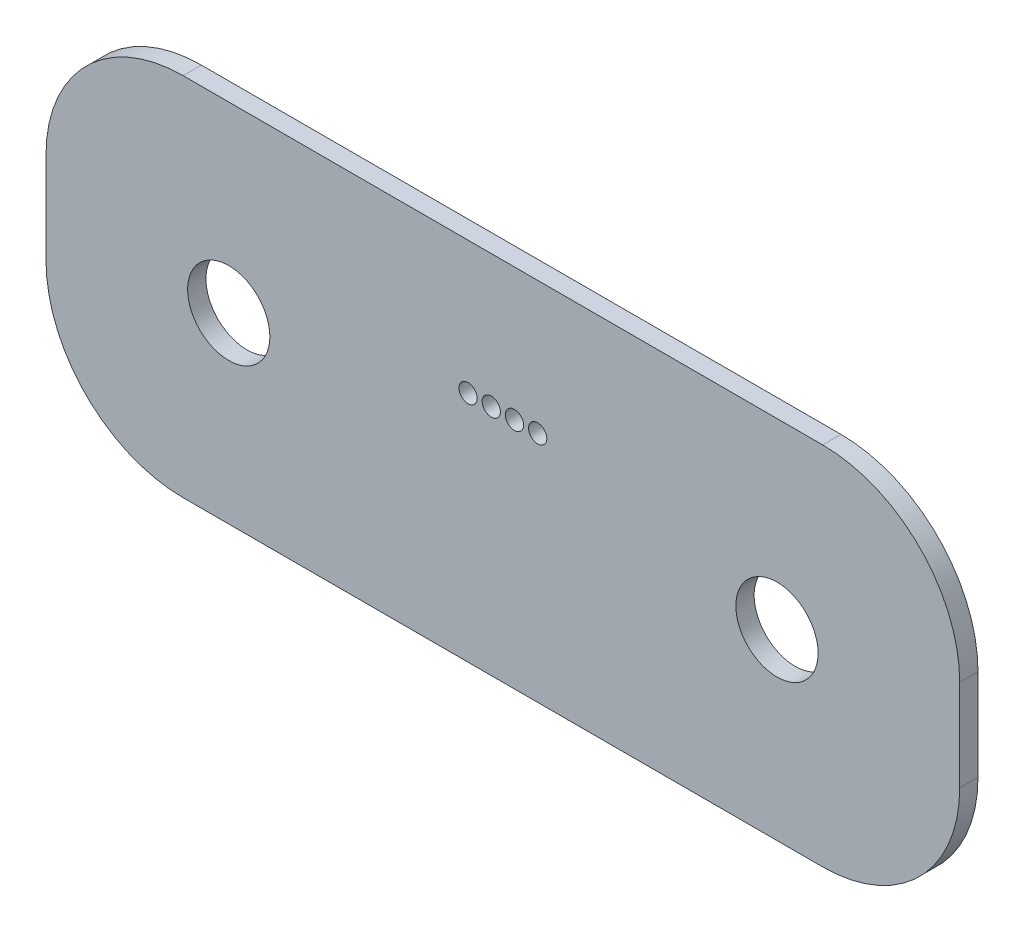
ISO-10303-21;
HEADER;
FILE_DESCRIPTION(('STEP AP214'),'2;1');
FILE_NAME('part.step','',(''),(''),'','','');
FILE_SCHEMA(('AUTOMOTIVE_DESIGN { 1 0 10303 214 1 1 1 1 }'));
ENDSEC;
DATA;
#1=APPLICATION_CONTEXT('core data for automotive mechanical design processes');
#2=APPLICATION_PROTOCOL_DEFINITION('international standard','automotive_design',2000,#1);
#3=PRODUCT_CONTEXT('',#1,'mechanical');
#4=PRODUCT('Part','Part','',(#3));
#5=PRODUCT_RELATED_PRODUCT_CATEGORY('part','',(#4));
#6=PRODUCT_DEFINITION_FORMATION('','',#4);
#7=PRODUCT_DEFINITION_CONTEXT('part definition',#1,'design');
#8=PRODUCT_DEFINITION('design','',#6,#7);
#9=PRODUCT_DEFINITION_SHAPE('','',#8);
#10=(LENGTH_UNIT() NAMED_UNIT(*) SI_UNIT(.MILLI.,.METRE.));
#11=(NAMED_UNIT(*) PLANE_ANGLE_UNIT() SI_UNIT($,.RADIAN.));
#12=(NAMED_UNIT(*) SI_UNIT($,.STERADIAN.) SOLID_ANGLE_UNIT());
#13=UNCERTAINTY_MEASURE_WITH_UNIT(LENGTH_MEASURE(1.E-05),#10,'distance_accuracy_value','');
#14=(GEOMETRIC_REPRESENTATION_CONTEXT(3) GLOBAL_UNCERTAINTY_ASSIGNED_CONTEXT((#13)) GLOBAL_UNIT_ASSIGNED_CONTEXT((#10,
#11,#12)) REPRESENTATION_CONTEXT('',''));
#15=CARTESIAN_POINT('',(0.,0.,0.));
#16=DIRECTION('',(0.,0.,1.));
#17=DIRECTION('',(1.,0.,0.));
#18=AXIS2_PLACEMENT_3D('',#15,#16,#17);
#19=CARTESIAN_POINT('',(-17.5,2.5,1.));
#20=DIRECTION('',(0.,0.,-1.));
#21=DIRECTION('',(-1.,0.,0.));
#22=AXIS2_PLACEMENT_3D('',#19,#20,#21);
#23=PLANE('',#22);
#24=CARTESIAN_POINT('',(-17.5,2.5,1.));
#25=DIRECTION('',(0.,0.,1.));
#26=DIRECTION('',(-1.,0.,0.));
#27=AXIS2_PLACEMENT_3D('',#24,#25,#26);
#28=CIRCLE('',#27,7.5);
#29=CARTESIAN_POINT('',(-17.5,10.,1.));
#30=VERTEX_POINT('',#29);
#31=CARTESIAN_POINT('',(-25.,2.5,1.));
#32=VERTEX_POINT('',#31);
#33=EDGE_CURVE('E168',#30,#32,#28,.T.);
#34=ORIENTED_EDGE('',*,*,#33,.T.);
#35=DIRECTION('',(0.,-1.,0.));
#36=VECTOR('',#35,1.);
#37=CARTESIAN_POINT('',(-25.,2.5,1.));
#38=LINE('',#37,#36);
#39=CARTESIAN_POINT('',(-25.,-2.5,1.));
#40=VERTEX_POINT('',#39);
#41=EDGE_CURVE('E104',#32,#40,#38,.T.);
#42=ORIENTED_EDGE('',*,*,#41,.T.);
#43=CARTESIAN_POINT('',(-17.5,-2.5,1.));
#44=DIRECTION('',(0.,0.,1.));
#45=DIRECTION('',(1.,0.,0.));
#46=AXIS2_PLACEMENT_3D('',#43,#44,#45);
#47=CIRCLE('',#46,7.5);
#48=CARTESIAN_POINT('',(-17.5,-10.,1.));
#49=VERTEX_POINT('',#48);
#50=EDGE_CURVE('E189',#40,#49,#47,.T.);
#51=ORIENTED_EDGE('',*,*,#50,.T.);
#52=DIRECTION('',(1.,0.,0.));
#53=VECTOR('',#52,1.);
#54=CARTESIAN_POINT('',(-17.5,-10.,1.));
#55=LINE('',#54,#53);
#56=CARTESIAN_POINT('',(17.5,-10.,1.));
#57=VERTEX_POINT('',#56);
#58=EDGE_CURVE('E203',#49,#57,#55,.T.);
#59=ORIENTED_EDGE('',*,*,#58,.T.);
#60=CARTESIAN_POINT('',(17.5,-2.5,1.));
#61=DIRECTION('',(0.,0.,1.));
#62=DIRECTION('',(1.,0.,0.));
#63=AXIS2_PLACEMENT_3D('',#60,#61,#62);
#64=CIRCLE('',#63,7.5);
#65=CARTESIAN_POINT('',(25.,-2.5,1.));
#66=VERTEX_POINT('',#65);
#67=EDGE_CURVE('E123',#57,#66,#64,.T.);
#68=ORIENTED_EDGE('',*,*,#67,.T.);
#69=DIRECTION('',(0.,1.,0.));
#70=VECTOR('',#69,1.);
#71=CARTESIAN_POINT('',(25.,-2.5,1.));
#72=LINE('',#71,#70);
#73=CARTESIAN_POINT('',(25.,2.50000000000001,1.));
#74=VERTEX_POINT('',#73);
#75=EDGE_CURVE('E117',#66,#74,#72,.T.);
#76=ORIENTED_EDGE('',*,*,#75,.T.);
#77=CARTESIAN_POINT('',(17.5,2.50000000000001,1.));
#78=DIRECTION('',(0.,0.,1.));
#79=DIRECTION('',(1.,0.,0.));
#80=AXIS2_PLACEMENT_3D('',#77,#78,#79);
#81=CIRCLE('',#80,7.5);
#82=CARTESIAN_POINT('',(17.5,10.,1.));
#83=VERTEX_POINT('',#82);
#84=EDGE_CURVE('E121',#74,#83,#81,.T.);
#85=ORIENTED_EDGE('',*,*,#84,.T.);
#86=DIRECTION('',(-1.,0.,0.));
#87=VECTOR('',#86,1.);
#88=CARTESIAN_POINT('',(17.5,10.,1.));
#89=LINE('',#88,#87);
#90=EDGE_CURVE('E61',#83,#30,#89,.T.);
#91=ORIENTED_EDGE('',*,*,#90,.T.);
#92=EDGE_LOOP('',(#34,#42,#51,#59,#68,#76,#85,#91));
#93=FACE_BOUND('',#92,.T.);
#94=CARTESIAN_POINT('',(-15.,0.,1.));
#95=DIRECTION('',(0.,0.,1.));
#96=DIRECTION('',(1.,0.,0.));
#97=AXIS2_PLACEMENT_3D('',#94,#95,#96);
#98=CIRCLE('',#97,2.25);
#99=CARTESIAN_POINT('',(-12.75,0.,1.));
#100=VERTEX_POINT('',#99);
#101=EDGE_CURVE('E150',#100,#100,#98,.T.);
#102=ORIENTED_EDGE('',*,*,#101,.F.);
#103=EDGE_LOOP('',(#102));
#104=FACE_BOUND('',#103,.T.);
#105=CARTESIAN_POINT('',(15.,0.,1.));
#106=DIRECTION('',(0.,0.,1.));
#107=DIRECTION('',(1.,0.,0.));
#108=AXIS2_PLACEMENT_3D('',#105,#106,#107);
#109=CIRCLE('',#108,2.25);
#110=CARTESIAN_POINT('',(17.25,0.,1.));
#111=VERTEX_POINT('',#110);
#112=EDGE_CURVE('E217',#111,#111,#109,.T.);
#113=ORIENTED_EDGE('',*,*,#112,.F.);
#114=EDGE_LOOP('',(#113));
#115=FACE_BOUND('',#114,.T.);
#116=CARTESIAN_POINT('',(-1.905,2.75,1.));
#117=DIRECTION('',(0.,0.,1.));
#118=DIRECTION('',(1.,0.,0.));
#119=AXIS2_PLACEMENT_3D('',#116,#117,#118);
#120=CIRCLE('',#119,0.5);
#121=CARTESIAN_POINT('',(-1.405,2.75,1.));
#122=VERTEX_POINT('',#121);
#123=EDGE_CURVE('E225',#122,#122,#120,.T.);
#124=ORIENTED_EDGE('',*,*,#123,.F.);
#125=EDGE_LOOP('',(#124));
#126=FACE_BOUND('',#125,.T.);
#127=CARTESIAN_POINT('',(1.905,2.75,1.));
#128=DIRECTION('',(0.,0.,1.));
#129=DIRECTION('',(1.,0.,0.));
#130=AXIS2_PLACEMENT_3D('',#127,#128,#129);
#131=CIRCLE('',#130,0.5);
#132=CARTESIAN_POINT('',(2.405,2.75,1.));
#133=VERTEX_POINT('',#132);
#134=EDGE_CURVE('E233',#133,#133,#131,.T.);
#135=ORIENTED_EDGE('',*,*,#134,.F.);
#136=EDGE_LOOP('',(#135));
#137=FACE_BOUND('',#136,.T.);
#138=CARTESIAN_POINT('',(0.635,2.75,1.));
#139=DIRECTION('',(0.,0.,1.));
#140=DIRECTION('',(1.,0.,0.));
#141=AXIS2_PLACEMENT_3D('',#138,#139,#140);
#142=CIRCLE('',#141,0.5);
#143=CARTESIAN_POINT('',(1.135,2.75,1.));
#144=VERTEX_POINT('',#143);
#145=EDGE_CURVE('E241',#144,#144,#142,.T.);
#146=ORIENTED_EDGE('',*,*,#145,.F.);
#147=EDGE_LOOP('',(#146));
#148=FACE_BOUND('',#147,.T.);
#149=CARTESIAN_POINT('',(-0.635,2.75,1.));
#150=DIRECTION('',(0.,0.,1.));
#151=DIRECTION('',(1.,0.,0.));
#152=AXIS2_PLACEMENT_3D('',#149,#150,#151);
#153=CIRCLE('',#152,0.5);
#154=CARTESIAN_POINT('',(-0.135,2.75,1.));
#155=VERTEX_POINT('',#154);
#156=EDGE_CURVE('E249',#155,#155,#153,.T.);
#157=ORIENTED_EDGE('',*,*,#156,.F.);
#158=EDGE_LOOP('',(#157));
#159=FACE_BOUND('',#158,.T.);
#160=ADVANCED_FACE('F43',(#93,#104,#115,#126,#137,#148,#159),#23,.F.);
#161=CARTESIAN_POINT('',(-17.5,2.5,0.));
#162=DIRECTION('',(0.,0.,-1.));
#163=DIRECTION('',(-1.,0.,0.));
#164=AXIS2_PLACEMENT_3D('',#161,#162,#163);
#165=PLANE('',#164);
#166=CARTESIAN_POINT('',(0.635,2.75,0.));
#167=DIRECTION('',(0.,0.,1.));
#168=DIRECTION('',(1.,0.,0.));
#169=AXIS2_PLACEMENT_3D('',#166,#167,#168);
#170=CIRCLE('',#169,0.5);
#171=CARTESIAN_POINT('',(1.135,2.75,0.));
#172=VERTEX_POINT('',#171);
#173=EDGE_CURVE('E245',#172,#172,#170,.T.);
#174=ORIENTED_EDGE('',*,*,#173,.T.);
#175=EDGE_LOOP('',(#174));
#176=FACE_BOUND('',#175,.T.);
#177=CARTESIAN_POINT('',(-1.905,2.75,0.));
#178=DIRECTION('',(0.,0.,1.));
#179=DIRECTION('',(1.,0.,0.));
#180=AXIS2_PLACEMENT_3D('',#177,#178,#179);
#181=CIRCLE('',#180,0.5);
#182=CARTESIAN_POINT('',(-1.405,2.75,0.));
#183=VERTEX_POINT('',#182);
#184=EDGE_CURVE('E229',#183,#183,#181,.T.);
#185=ORIENTED_EDGE('',*,*,#184,.T.);
#186=EDGE_LOOP('',(#185));
#187=FACE_BOUND('',#186,.T.);
#188=CARTESIAN_POINT('',(-15.,0.,0.));
#189=DIRECTION('',(0.,0.,1.));
#190=DIRECTION('',(1.,0.,0.));
#191=AXIS2_PLACEMENT_3D('',#188,#189,#190);
#192=CIRCLE('',#191,2.25);
#193=CARTESIAN_POINT('',(-12.75,0.,0.));
#194=VERTEX_POINT('',#193);
#195=EDGE_CURVE('E213',#194,#194,#192,.T.);
#196=ORIENTED_EDGE('',*,*,#195,.T.);
#197=EDGE_LOOP('',(#196));
#198=FACE_BOUND('',#197,.T.);
#199=CARTESIAN_POINT('',(-17.5,2.5,0.));
#200=DIRECTION('',(0.,0.,1.));
#201=DIRECTION('',(-1.,0.,0.));
#202=AXIS2_PLACEMENT_3D('',#199,#200,#201);
#203=CIRCLE('',#202,7.5);
#204=CARTESIAN_POINT('',(-17.5,10.,0.));
#205=VERTEX_POINT('',#204);
#206=CARTESIAN_POINT('',(-25.,2.5,0.));
#207=VERTEX_POINT('',#206);
#208=EDGE_CURVE('E145',#205,#207,#203,.T.);
#209=ORIENTED_EDGE('',*,*,#208,.F.);
#210=DIRECTION('',(-1.,0.,0.));
#211=VECTOR('',#210,1.);
#212=CARTESIAN_POINT('',(17.5,10.,0.));
#213=LINE('',#212,#211);
#214=CARTESIAN_POINT('',(17.5,10.,0.));
#215=VERTEX_POINT('',#214);
#216=EDGE_CURVE('E96',#215,#205,#213,.T.);
#217=ORIENTED_EDGE('',*,*,#216,.F.);
#218=CARTESIAN_POINT('',(17.5,2.50000000000001,0.));
#219=DIRECTION('',(0.,0.,1.));
#220=DIRECTION('',(1.,0.,0.));
#221=AXIS2_PLACEMENT_3D('',#218,#219,#220);
#222=CIRCLE('',#221,7.5);
#223=CARTESIAN_POINT('',(25.,2.50000000000001,0.));
#224=VERTEX_POINT('',#223);
#225=EDGE_CURVE('E90',#224,#215,#222,.T.);
#226=ORIENTED_EDGE('',*,*,#225,.F.);
#227=DIRECTION('',(0.,1.,0.));
#228=VECTOR('',#227,1.);
#229=CARTESIAN_POINT('',(25.,-2.5,0.));
#230=LINE('',#229,#228);
#231=CARTESIAN_POINT('',(25.,-2.5,0.));
#232=VERTEX_POINT('',#231);
#233=EDGE_CURVE('E132',#232,#224,#230,.T.);
#234=ORIENTED_EDGE('',*,*,#233,.F.);
#235=CARTESIAN_POINT('',(17.5,-2.5,0.));
#236=DIRECTION('',(0.,0.,1.));
#237=DIRECTION('',(1.,0.,0.));
#238=AXIS2_PLACEMENT_3D('',#235,#236,#237);
#239=CIRCLE('',#238,7.5);
#240=CARTESIAN_POINT('',(17.5,-10.,0.));
#241=VERTEX_POINT('',#240);
#242=EDGE_CURVE('E159',#241,#232,#239,.T.);
#243=ORIENTED_EDGE('',*,*,#242,.F.);
#244=DIRECTION('',(1.,0.,0.));
#245=VECTOR('',#244,1.);
#246=CARTESIAN_POINT('',(-17.5,-10.,0.));
#247=LINE('',#246,#245);
#248=CARTESIAN_POINT('',(-17.5,-10.,0.));
#249=VERTEX_POINT('',#248);
#250=EDGE_CURVE('E156',#249,#241,#247,.T.);
#251=ORIENTED_EDGE('',*,*,#250,.F.);
#252=CARTESIAN_POINT('',(-17.5,-2.5,0.));
#253=DIRECTION('',(0.,0.,1.));
#254=DIRECTION('',(1.,0.,0.));
#255=AXIS2_PLACEMENT_3D('',#252,#253,#254);
#256=CIRCLE('',#255,7.5);
#257=CARTESIAN_POINT('',(-25.,-2.5,0.));
#258=VERTEX_POINT('',#257);
#259=EDGE_CURVE('E153',#258,#249,#256,.T.);
#260=ORIENTED_EDGE('',*,*,#259,.F.);
#261=DIRECTION('',(0.,-1.,0.));
#262=VECTOR('',#261,1.);
#263=CARTESIAN_POINT('',(-25.,2.5,0.));
#264=LINE('',#263,#262);
#265=EDGE_CURVE('E149',#207,#258,#264,.T.);
#266=ORIENTED_EDGE('',*,*,#265,.F.);
#267=EDGE_LOOP('',(#209,#217,#226,#234,#243,#251,#260,#266));
#268=FACE_BOUND('',#267,.T.);
#269=CARTESIAN_POINT('',(15.,0.,0.));
#270=DIRECTION('',(0.,0.,1.));
#271=DIRECTION('',(1.,0.,0.));
#272=AXIS2_PLACEMENT_3D('',#269,#270,#271);
#273=CIRCLE('',#272,2.25);
#274=CARTESIAN_POINT('',(17.25,0.,0.));
#275=VERTEX_POINT('',#274);
#276=EDGE_CURVE('E221',#275,#275,#273,.T.);
#277=ORIENTED_EDGE('',*,*,#276,.T.);
#278=EDGE_LOOP('',(#277));
#279=FACE_BOUND('',#278,.T.);
#280=CARTESIAN_POINT('',(1.905,2.75,0.));
#281=DIRECTION('',(0.,0.,1.));
#282=DIRECTION('',(1.,0.,0.));
#283=AXIS2_PLACEMENT_3D('',#280,#281,#282);
#284=CIRCLE('',#283,0.5);
#285=CARTESIAN_POINT('',(2.405,2.75,0.));
#286=VERTEX_POINT('',#285);
#287=EDGE_CURVE('E237',#286,#286,#284,.T.);
#288=ORIENTED_EDGE('',*,*,#287,.T.);
#289=EDGE_LOOP('',(#288));
#290=FACE_BOUND('',#289,.T.);
#291=CARTESIAN_POINT('',(-0.635,2.75,0.));
#292=DIRECTION('',(0.,0.,1.));
#293=DIRECTION('',(1.,0.,0.));
#294=AXIS2_PLACEMENT_3D('',#291,#292,#293);
#295=CIRCLE('',#294,0.5);
#296=CARTESIAN_POINT('',(-0.135,2.75,0.));
#297=VERTEX_POINT('',#296);
#298=EDGE_CURVE('E253',#297,#297,#295,.T.);
#299=ORIENTED_EDGE('',*,*,#298,.T.);
#300=EDGE_LOOP('',(#299));
#301=FACE_BOUND('',#300,.T.);
#302=ADVANCED_FACE('F193',(#176,#187,#198,#268,#279,#290,#301),#165,.T.);
#303=CARTESIAN_POINT('',(-17.5,2.5,1.));
#304=DIRECTION('',(0.,0.,-1.));
#305=DIRECTION('',(-1.,0.,0.));
#306=AXIS2_PLACEMENT_3D('',#303,#304,#305);
#307=CYLINDRICAL_SURFACE('',#306,7.5);
#308=ORIENTED_EDGE('',*,*,#208,.T.);
#309=DIRECTION('',(0.,0.,-1.));
#310=VECTOR('',#309,1.);
#311=CARTESIAN_POINT('',(-25.,2.5,1.));
#312=LINE('',#311,#310);
#313=EDGE_CURVE('E11',#32,#207,#312,.T.);
#314=ORIENTED_EDGE('',*,*,#313,.F.);
#315=ORIENTED_EDGE('',*,*,#33,.F.);
#316=DIRECTION('',(0.,0.,-1.));
#317=VECTOR('',#316,1.);
#318=CARTESIAN_POINT('',(-17.5,10.,1.));
#319=LINE('',#318,#317);
#320=EDGE_CURVE('E141',#30,#205,#319,.T.);
#321=ORIENTED_EDGE('',*,*,#320,.T.);
#322=EDGE_LOOP('',(#308,#314,#315,#321));
#323=FACE_BOUND('',#322,.T.);
#324=ADVANCED_FACE('F45',(#323),#307,.T.);
#325=CARTESIAN_POINT('',(-25.,2.5,1.));
#326=DIRECTION('',(1.,0.,0.));
#327=DIRECTION('',(0.,0.,-1.));
#328=AXIS2_PLACEMENT_3D('',#325,#326,#327);
#329=PLANE('',#328);
#330=ORIENTED_EDGE('',*,*,#265,.T.);
#331=DIRECTION('',(0.,0.,-1.));
#332=VECTOR('',#331,1.);
#333=CARTESIAN_POINT('',(-25.,-2.5,1.));
#334=LINE('',#333,#332);
#335=EDGE_CURVE('E53',#40,#258,#334,.T.);
#336=ORIENTED_EDGE('',*,*,#335,.F.);
#337=ORIENTED_EDGE('',*,*,#41,.F.);
#338=ORIENTED_EDGE('',*,*,#313,.T.);
#339=EDGE_LOOP('',(#330,#336,#337,#338));
#340=FACE_BOUND('',#339,.T.);
#341=ADVANCED_FACE('F287',(#340),#329,.F.);
#342=CARTESIAN_POINT('',(-17.5,-2.5,1.));
#343=DIRECTION('',(0.,0.,-1.));
#344=DIRECTION('',(-1.,0.,0.));
#345=AXIS2_PLACEMENT_3D('',#342,#343,#344);
#346=CYLINDRICAL_SURFACE('',#345,7.5);
#347=ORIENTED_EDGE('',*,*,#259,.T.);
#348=DIRECTION('',(0.,0.,-1.));
#349=VECTOR('',#348,1.);
#350=CARTESIAN_POINT('',(-17.5,-10.,1.));
#351=LINE('',#350,#349);
#352=EDGE_CURVE('E179',#49,#249,#351,.T.);
#353=ORIENTED_EDGE('',*,*,#352,.F.);
#354=ORIENTED_EDGE('',*,*,#50,.F.);
#355=ORIENTED_EDGE('',*,*,#335,.T.);
#356=EDGE_LOOP('',(#347,#353,#354,#355));
#357=FACE_BOUND('',#356,.T.);
#358=ADVANCED_FACE('F187',(#357),#346,.T.);
#359=CARTESIAN_POINT('',(-17.5,-10.,1.));
#360=DIRECTION('',(0.,1.,0.));
#361=DIRECTION('',(-1.,0.,0.));
#362=AXIS2_PLACEMENT_3D('',#359,#360,#361);
#363=PLANE('',#362);
#364=ORIENTED_EDGE('',*,*,#250,.T.);
#365=DIRECTION('',(0.,0.,-1.));
#366=VECTOR('',#365,1.);
#367=CARTESIAN_POINT('',(17.5,-10.,1.));
#368=LINE('',#367,#366);
#369=EDGE_CURVE('E175',#57,#241,#368,.T.);
#370=ORIENTED_EDGE('',*,*,#369,.F.);
#371=ORIENTED_EDGE('',*,*,#58,.F.);
#372=ORIENTED_EDGE('',*,*,#352,.T.);
#373=EDGE_LOOP('',(#364,#370,#371,#372));
#374=FACE_BOUND('',#373,.T.);
#375=ADVANCED_FACE('F198',(#374),#363,.F.);
#376=CARTESIAN_POINT('',(17.5,-2.5,1.));
#377=DIRECTION('',(0.,0.,-1.));
#378=DIRECTION('',(-1.,0.,0.));
#379=AXIS2_PLACEMENT_3D('',#376,#377,#378);
#380=CYLINDRICAL_SURFACE('',#379,7.5);
#381=ORIENTED_EDGE('',*,*,#242,.T.);
#382=DIRECTION('',(0.,0.,-1.));
#383=VECTOR('',#382,1.);
#384=CARTESIAN_POINT('',(25.,-2.5,1.));
#385=LINE('',#384,#383);
#386=EDGE_CURVE('E134',#66,#232,#385,.T.);
#387=ORIENTED_EDGE('',*,*,#386,.F.);
#388=ORIENTED_EDGE('',*,*,#67,.F.);
#389=ORIENTED_EDGE('',*,*,#369,.T.);
#390=EDGE_LOOP('',(#381,#387,#388,#389));
#391=FACE_BOUND('',#390,.T.);
#392=ADVANCED_FACE('F201',(#391),#380,.T.);
#393=CARTESIAN_POINT('',(25.,-2.5,1.));
#394=DIRECTION('',(-1.,0.,0.));
#395=DIRECTION('',(0.,0.,1.));
#396=AXIS2_PLACEMENT_3D('',#393,#394,#395);
#397=PLANE('',#396);
#398=ORIENTED_EDGE('',*,*,#233,.T.);
#399=DIRECTION('',(0.,0.,-1.));
#400=VECTOR('',#399,1.);
#401=CARTESIAN_POINT('',(25.,2.50000000000001,1.));
#402=LINE('',#401,#400);
#403=EDGE_CURVE('E129',#74,#224,#402,.T.);
#404=ORIENTED_EDGE('',*,*,#403,.F.);
#405=ORIENTED_EDGE('',*,*,#75,.F.);
#406=ORIENTED_EDGE('',*,*,#386,.T.);
#407=EDGE_LOOP('',(#398,#404,#405,#406));
#408=FACE_BOUND('',#407,.T.);
#409=ADVANCED_FACE('F130',(#408),#397,.F.);
#410=CARTESIAN_POINT('',(17.5,2.50000000000001,1.));
#411=DIRECTION('',(0.,0.,-1.));
#412=DIRECTION('',(-1.,0.,0.));
#413=AXIS2_PLACEMENT_3D('',#410,#411,#412);
#414=CYLINDRICAL_SURFACE('',#413,7.5);
#415=ORIENTED_EDGE('',*,*,#225,.T.);
#416=DIRECTION('',(0.,0.,-1.));
#417=VECTOR('',#416,1.);
#418=CARTESIAN_POINT('',(17.5,10.,1.));
#419=LINE('',#418,#417);
#420=EDGE_CURVE('E135',#83,#215,#419,.T.);
#421=ORIENTED_EDGE('',*,*,#420,.F.);
#422=ORIENTED_EDGE('',*,*,#84,.F.);
#423=ORIENTED_EDGE('',*,*,#403,.T.);
#424=EDGE_LOOP('',(#415,#421,#422,#423));
#425=FACE_BOUND('',#424,.T.);
#426=ADVANCED_FACE('F137',(#425),#414,.T.);
#427=CARTESIAN_POINT('',(17.5,10.,1.));
#428=DIRECTION('',(0.,-1.,0.));
#429=DIRECTION('',(1.,0.,0.));
#430=AXIS2_PLACEMENT_3D('',#427,#428,#429);
#431=PLANE('',#430);
#432=ORIENTED_EDGE('',*,*,#216,.T.);
#433=ORIENTED_EDGE('',*,*,#320,.F.);
#434=ORIENTED_EDGE('',*,*,#90,.F.);
#435=ORIENTED_EDGE('',*,*,#420,.T.);
#436=EDGE_LOOP('',(#432,#433,#434,#435));
#437=FACE_BOUND('',#436,.T.);
#438=ADVANCED_FACE('F275',(#437),#431,.F.);
#439=CARTESIAN_POINT('',(-15.,0.,1.));
#440=DIRECTION('',(0.,0.,-1.));
#441=DIRECTION('',(-1.,0.,0.));
#442=AXIS2_PLACEMENT_3D('',#439,#440,#441);
#443=CYLINDRICAL_SURFACE('',#442,2.25);
#444=ORIENTED_EDGE('',*,*,#101,.T.);
#445=EDGE_LOOP('',(#444));
#446=FACE_BOUND('',#445,.T.);
#447=ORIENTED_EDGE('',*,*,#195,.F.);
#448=EDGE_LOOP('',(#447));
#449=FACE_BOUND('',#448,.T.);
#450=ADVANCED_FACE('F272',(#446,#449),#443,.F.);
#451=CARTESIAN_POINT('',(15.,0.,1.));
#452=DIRECTION('',(0.,0.,-1.));
#453=DIRECTION('',(-1.,0.,0.));
#454=AXIS2_PLACEMENT_3D('',#451,#452,#453);
#455=CYLINDRICAL_SURFACE('',#454,2.25);
#456=ORIENTED_EDGE('',*,*,#112,.T.);
#457=EDGE_LOOP('',(#456));
#458=FACE_BOUND('',#457,.T.);
#459=ORIENTED_EDGE('',*,*,#276,.F.);
#460=EDGE_LOOP('',(#459));
#461=FACE_BOUND('',#460,.T.);
#462=ADVANCED_FACE('F363',(#458,#461),#455,.F.);
#463=CARTESIAN_POINT('',(-1.905,2.75,1.));
#464=DIRECTION('',(0.,0.,-1.));
#465=DIRECTION('',(-1.,0.,0.));
#466=AXIS2_PLACEMENT_3D('',#463,#464,#465);
#467=CYLINDRICAL_SURFACE('',#466,0.5);
#468=ORIENTED_EDGE('',*,*,#123,.T.);
#469=EDGE_LOOP('',(#468));
#470=FACE_BOUND('',#469,.T.);
#471=ORIENTED_EDGE('',*,*,#184,.F.);
#472=EDGE_LOOP('',(#471));
#473=FACE_BOUND('',#472,.T.);
#474=ADVANCED_FACE('F372',(#470,#473),#467,.F.);
#475=CARTESIAN_POINT('',(1.905,2.75,1.));
#476=DIRECTION('',(0.,0.,-1.));
#477=DIRECTION('',(-1.,0.,0.));
#478=AXIS2_PLACEMENT_3D('',#475,#476,#477);
#479=CYLINDRICAL_SURFACE('',#478,0.5);
#480=ORIENTED_EDGE('',*,*,#134,.T.);
#481=EDGE_LOOP('',(#480));
#482=FACE_BOUND('',#481,.T.);
#483=ORIENTED_EDGE('',*,*,#287,.F.);
#484=EDGE_LOOP('',(#483));
#485=FACE_BOUND('',#484,.T.);
#486=ADVANCED_FACE('F381',(#482,#485),#479,.F.);
#487=CARTESIAN_POINT('',(0.635,2.75,1.));
#488=DIRECTION('',(0.,0.,-1.));
#489=DIRECTION('',(-1.,0.,0.));
#490=AXIS2_PLACEMENT_3D('',#487,#488,#489);
#491=CYLINDRICAL_SURFACE('',#490,0.5);
#492=ORIENTED_EDGE('',*,*,#145,.T.);
#493=EDGE_LOOP('',(#492));
#494=FACE_BOUND('',#493,.T.);
#495=ORIENTED_EDGE('',*,*,#173,.F.);
#496=EDGE_LOOP('',(#495));
#497=FACE_BOUND('',#496,.T.);
#498=ADVANCED_FACE('F391',(#494,#497),#491,.F.);
#499=CARTESIAN_POINT('',(-0.635,2.75,1.));
#500=DIRECTION('',(0.,0.,-1.));
#501=DIRECTION('',(-1.,0.,0.));
#502=AXIS2_PLACEMENT_3D('',#499,#500,#501);
#503=CYLINDRICAL_SURFACE('',#502,0.5);
#504=ORIENTED_EDGE('',*,*,#156,.T.);
#505=EDGE_LOOP('',(#504));
#506=FACE_BOUND('',#505,.T.);
#507=ORIENTED_EDGE('',*,*,#298,.F.);
#508=EDGE_LOOP('',(#507));
#509=FACE_BOUND('',#508,.T.);
#510=ADVANCED_FACE('F261',(#506,#509),#503,.F.);
#511=CLOSED_SHELL('',(#160,#302,#324,#341,#358,#375,#392,#409,#426,#438,#450,#462,#474,#486,
#498,#510));
#512=MANIFOLD_SOLID_BREP('B2',#511);
#513=ADVANCED_BREP_SHAPE_REPRESENTATION('',(#18,#512),#14);
#514=SHAPE_DEFINITION_REPRESENTATION(#9,#513);
ENDSEC;
END-ISO-10303-21;
